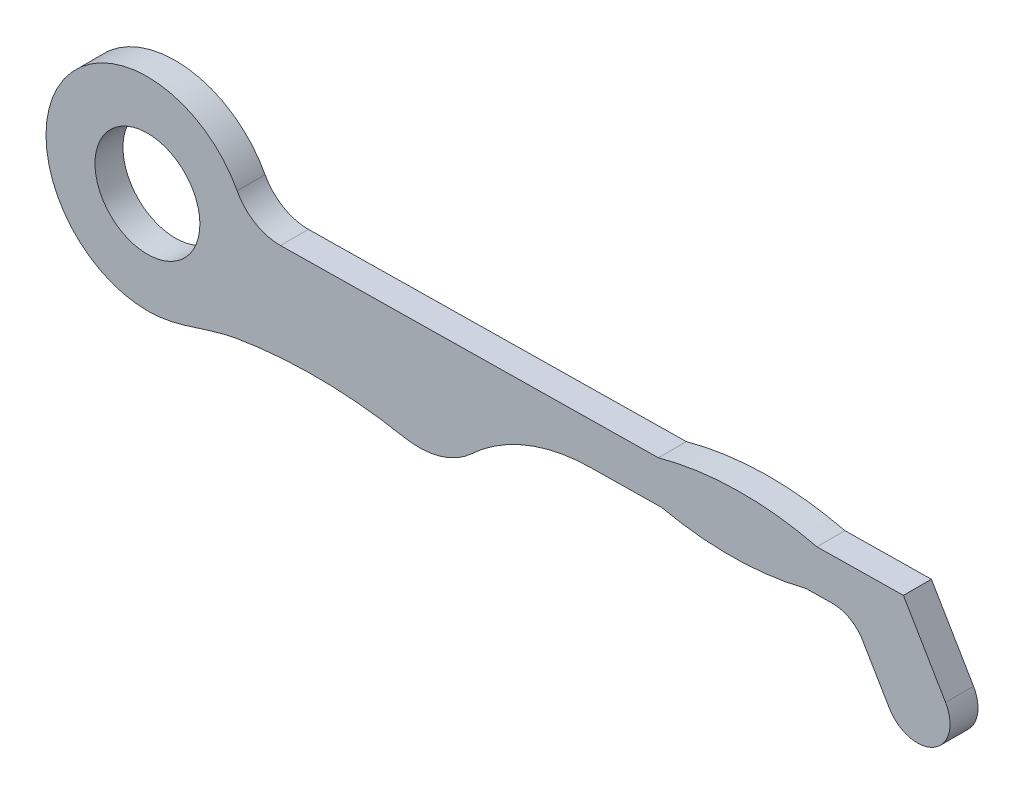
ISO-10303-21;
HEADER;
FILE_DESCRIPTION(('STEP AP214'),'2;1');
FILE_NAME('part.step','',(''),(''),'','','');
FILE_SCHEMA(('AUTOMOTIVE_DESIGN { 1 0 10303 214 1 1 1 1 }'));
ENDSEC;
DATA;
#1=APPLICATION_CONTEXT('core data for automotive mechanical design processes');
#2=APPLICATION_PROTOCOL_DEFINITION('international standard','automotive_design',2000,#1);
#3=PRODUCT_CONTEXT('',#1,'mechanical');
#4=PRODUCT('Part','Part','',(#3));
#5=PRODUCT_RELATED_PRODUCT_CATEGORY('part','',(#4));
#6=PRODUCT_DEFINITION_FORMATION('','',#4);
#7=PRODUCT_DEFINITION_CONTEXT('part definition',#1,'design');
#8=PRODUCT_DEFINITION('design','',#6,#7);
#9=PRODUCT_DEFINITION_SHAPE('','',#8);
#10=(LENGTH_UNIT() NAMED_UNIT(*) SI_UNIT(.MILLI.,.METRE.));
#11=(NAMED_UNIT(*) PLANE_ANGLE_UNIT() SI_UNIT($,.RADIAN.));
#12=(NAMED_UNIT(*) SI_UNIT($,.STERADIAN.) SOLID_ANGLE_UNIT());
#13=UNCERTAINTY_MEASURE_WITH_UNIT(LENGTH_MEASURE(1.E-05),#10,'distance_accuracy_value','');
#14=(GEOMETRIC_REPRESENTATION_CONTEXT(3) GLOBAL_UNCERTAINTY_ASSIGNED_CONTEXT((#13)) GLOBAL_UNIT_ASSIGNED_CONTEXT((#10,
#11,#12)) REPRESENTATION_CONTEXT('',''));
#15=CARTESIAN_POINT('',(0.,0.,0.));
#16=DIRECTION('',(0.,0.,1.));
#17=DIRECTION('',(1.,0.,0.));
#18=AXIS2_PLACEMENT_3D('',#15,#16,#17);
#19=CARTESIAN_POINT('',(11.0069561086532,-0.829151401691462,0.));
#20=DIRECTION('',(0.,0.,-1.));
#21=DIRECTION('',(-1.,0.,0.));
#22=AXIS2_PLACEMENT_3D('',#19,#20,#21);
#23=CYLINDRICAL_SURFACE('',#22,0.466533793959635);
#24=DIRECTION('',(0.,0.,-1.));
#25=VECTOR('',#24,1.);
#26=CARTESIAN_POINT('',(10.6048304525625,-1.06568625667051,0.4));
#27=LINE('',#26,#25);
#28=CARTESIAN_POINT('',(10.6048304525625,-1.06568625667051,0.));
#29=VERTEX_POINT('',#28);
#30=CARTESIAN_POINT('',(10.6048304525625,-1.06568625667051,0.4));
#31=VERTEX_POINT('',#30);
#32=EDGE_CURVE('E151',#29,#31,#27,.F.);
#33=ORIENTED_EDGE('',*,*,#32,.F.);
#34=CARTESIAN_POINT('',(11.0069561086532,-0.829151401691462,0.));
#35=DIRECTION('',(0.,0.,-1.));
#36=DIRECTION('',(-1.,0.,0.));
#37=AXIS2_PLACEMENT_3D('',#34,#35,#36);
#38=CIRCLE('',#37,0.466533793959635);
#39=CARTESIAN_POINT('',(11.409081764744,-0.592616546712413,0.));
#40=VERTEX_POINT('',#39);
#41=EDGE_CURVE('E24',#40,#29,#38,.T.);
#42=ORIENTED_EDGE('',*,*,#41,.F.);
#43=DIRECTION('',(0.,0.,-1.));
#44=VECTOR('',#43,1.);
#45=CARTESIAN_POINT('',(11.409081764744,-0.592616546712413,0.4));
#46=LINE('',#45,#44);
#47=CARTESIAN_POINT('',(11.409081764744,-0.592616546712413,0.4));
#48=VERTEX_POINT('',#47);
#49=EDGE_CURVE('E154',#48,#40,#46,.T.);
#50=ORIENTED_EDGE('',*,*,#49,.F.);
#51=CARTESIAN_POINT('',(11.0069561086532,-0.829151401691462,0.4));
#52=DIRECTION('',(0.,0.,-1.));
#53=DIRECTION('',(-1.,0.,0.));
#54=AXIS2_PLACEMENT_3D('',#51,#52,#53);
#55=CIRCLE('',#54,0.466533793959635);
#56=EDGE_CURVE('E11',#31,#48,#55,.F.);
#57=ORIENTED_EDGE('',*,*,#56,.F.);
#58=EDGE_LOOP('',(#33,#42,#50,#57));
#59=FACE_BOUND('',#58,.T.);
#60=ADVANCED_FACE('F17',(#59),#23,.T.);
#61=CARTESIAN_POINT('',(0.7171259454491,-1.30534728897649,0.4));
#62=DIRECTION('',(0.,0.,-1.));
#63=DIRECTION('',(-1.,0.,0.));
#64=AXIS2_PLACEMENT_3D('',#61,#62,#63);
#65=PLANE('',#64);
#66=DIRECTION('',(0.507004761587571,-0.861943253194507,0.));
#67=VECTOR('',#66,1.);
#68=CARTESIAN_POINT('',(10.8413653075415,-1.46781191276126,0.4));
#69=LINE('',#68,#67);
#70=CARTESIAN_POINT('',(10.2248321372136,-0.419662769406474,0.4));
#71=VERTEX_POINT('',#70);
#72=EDGE_CURVE('E253',#71,#31,#69,.T.);
#73=ORIENTED_EDGE('',*,*,#72,.T.);
#74=ORIENTED_EDGE('',*,*,#56,.T.);
#75=DIRECTION('',(-0.507004761587571,0.861943253194507,0.));
#76=VECTOR('',#75,1.);
#77=CARTESIAN_POINT('',(10.8068833380613,0.431162538395529,0.4));
#78=LINE('',#77,#76);
#79=CARTESIAN_POINT('',(10.8068833380613,0.431162538395529,0.4));
#80=VERTEX_POINT('',#79);
#81=EDGE_CURVE('E256',#48,#80,#78,.T.);
#82=ORIENTED_EDGE('',*,*,#81,.T.);
#83=DIRECTION('',(-0.9999073649914,-0.0136110776926834,0.));
#84=VECTOR('',#83,1.);
#85=CARTESIAN_POINT('',(9.57025830153125,0.414329179588264,0.4));
#86=LINE('',#85,#84);
#87=CARTESIAN_POINT('',(9.57025830153125,0.414329179588263,0.4));
#88=VERTEX_POINT('',#87);
#89=EDGE_CURVE('E263',#80,#88,#86,.T.);
#90=ORIENTED_EDGE('',*,*,#89,.T.);
#91=CARTESIAN_POINT('',(8.49635173682715,-3.97918408643246,0.4));
#92=DIRECTION('',(0.,0.,1.));
#93=DIRECTION('',(-1.,0.,0.));
#94=AXIS2_PLACEMENT_3D('',#91,#92,#93);
#95=CIRCLE('',#94,4.52285685473403);
#96=CARTESIAN_POINT('',(7.30325325748275,0.38346993915801,0.4));
#97=VERTEX_POINT('',#96);
#98=EDGE_CURVE('E265',#88,#97,#95,.T.);
#99=ORIENTED_EDGE('',*,*,#98,.T.);
#100=DIRECTION('',(-0.999907364991399,-0.0136110776926838,0.));
#101=VECTOR('',#100,1.);
#102=CARTESIAN_POINT('',(1.90195888158787,0.309945690847274,0.4));
#103=LINE('',#102,#101);
#104=CARTESIAN_POINT('',(1.90195888158787,0.309945690847274,0.4));
#105=VERTEX_POINT('',#104);
#106=EDGE_CURVE('E267',#97,#105,#103,.T.);
#107=ORIENTED_EDGE('',*,*,#106,.T.);
#108=CARTESIAN_POINT('',(1.89255571432794,1.00072833199703,0.4));
#109=DIRECTION('',(0.,0.,-1.));
#110=DIRECTION('',(1.,0.,0.));
#111=AXIS2_PLACEMENT_3D('',#108,#109,#110);
#112=CIRCLE('',#111,0.690846637733987);
#113=CARTESIAN_POINT('',(1.2818320272956,0.677795436543549,0.4));
#114=VERTEX_POINT('',#113);
#115=EDGE_CURVE('E269',#105,#114,#112,.T.);
#116=ORIENTED_EDGE('',*,*,#115,.T.);
#117=CARTESIAN_POINT('',(0.,0.,0.4));
#118=DIRECTION('',(0.,0.,1.));
#119=DIRECTION('',(-1.,0.,0.));
#120=AXIS2_PLACEMENT_3D('',#117,#118,#119);
#121=CIRCLE('',#120,1.45);
#122=CARTESIAN_POINT('',(0.164619343939182,-1.44062502810448,0.4));
#123=VERTEX_POINT('',#122);
#124=EDGE_CURVE('E142',#114,#123,#121,.T.);
#125=ORIENTED_EDGE('',*,*,#124,.T.);
#126=CARTESIAN_POINT('',(0.164619343939182,-1.44062502810448,0.4));
#127=CARTESIAN_POINT('',(0.54082096935865,-1.3976366976526,0.4));
#128=CARTESIAN_POINT('',(0.893291203337348,-1.21821652481014,0.4));
#129=CARTESIAN_POINT('',(1.27005170156563,-1.15459361631923,0.4));
#130=B_SPLINE_CURVE_WITH_KNOTS('',3,(#126,#127,#128,#129),.UNSPECIFIED.,.F.,.F.,(4,4),(0.,1.),.UNSPECIFIED.);
#131=CARTESIAN_POINT('',(1.27005170156563,-1.15459361631923,0.4));
#132=VERTEX_POINT('',#131);
#133=EDGE_CURVE('E136',#123,#132,#130,.T.);
#134=ORIENTED_EDGE('',*,*,#133,.T.);
#135=CARTESIAN_POINT('',(2.39897537458569,-7.83982470048959,0.4));
#136=DIRECTION('',(0.,0.,-1.));
#137=DIRECTION('',(1.,0.,0.));
#138=AXIS2_PLACEMENT_3D('',#135,#136,#137);
#139=CIRCLE('',#138,6.77988077389734);
#140=CARTESIAN_POINT('',(3.67253291127212,-1.1806329695802,0.4));
#141=VERTEX_POINT('',#140);
#142=EDGE_CURVE('E126',#132,#141,#139,.T.);
#143=ORIENTED_EDGE('',*,*,#142,.T.);
#144=CARTESIAN_POINT('',(3.87956275257858,-0.0981130460072852,0.4));
#145=DIRECTION('',(0.,0.,1.));
#146=DIRECTION('',(-1.,0.,0.));
#147=AXIS2_PLACEMENT_3D('',#144,#145,#146);
#148=CIRCLE('',#147,1.10213916549758);
#149=CARTESIAN_POINT('',(4.63202179538023,-0.903418037317869,0.4));
#150=VERTEX_POINT('',#149);
#151=EDGE_CURVE('E135',#141,#150,#148,.T.);
#152=ORIENTED_EDGE('',*,*,#151,.T.);
#153=CARTESIAN_POINT('',(6.35868867322535,-2.75135045086439,0.4));
#154=DIRECTION('',(0.,0.,-1.));
#155=DIRECTION('',(1.,0.,0.));
#156=AXIS2_PLACEMENT_3D('',#153,#154,#155);
#157=CIRCLE('',#156,2.52907744287978);
#158=CARTESIAN_POINT('',(6.3242652036595,-0.222507289095287,0.4));
#159=VERTEX_POINT('',#158);
#160=EDGE_CURVE('E229',#150,#159,#157,.T.);
#161=ORIENTED_EDGE('',*,*,#160,.T.);
#162=DIRECTION('',(0.999907364991399,0.0136110776926834,0.));
#163=VECTOR('',#162,1.);
#164=CARTESIAN_POINT('',(7.35154031889645,-0.208523672317576,0.4));
#165=LINE('',#164,#163);
#166=CARTESIAN_POINT('',(7.35154031889644,-0.208523672317575,0.4));
#167=VERTEX_POINT('',#166);
#168=EDGE_CURVE('E280',#159,#167,#165,.T.);
#169=ORIENTED_EDGE('',*,*,#168,.T.);
#170=CARTESIAN_POINT('',(8.32464084870636,4.17186383087633,0.4));
#171=DIRECTION('',(0.,0.,1.));
#172=DIRECTION('',(1.,0.,0.));
#173=AXIS2_PLACEMENT_3D('',#170,#171,#172);
#174=CIRCLE('',#173,4.48717275344439);
#175=CARTESIAN_POINT('',(9.41661336564246,-0.180413198623276,0.4));
#176=VERTEX_POINT('',#175);
#177=EDGE_CURVE('E258',#167,#176,#174,.T.);
#178=ORIENTED_EDGE('',*,*,#177,.T.);
#179=DIRECTION('',(0.9999073649914,0.0136110776926837,0.));
#180=VECTOR('',#179,1.);
#181=CARTESIAN_POINT('',(9.79079977857938,-0.175319646443995,0.4));
#182=LINE('',#181,#180);
#183=CARTESIAN_POINT('',(9.79079977857938,-0.175319646443996,0.4));
#184=VERTEX_POINT('',#183);
#185=EDGE_CURVE('E254',#176,#184,#182,.T.);
#186=ORIENTED_EDGE('',*,*,#185,.T.);
#187=CARTESIAN_POINT('',(9.79754710189913,-0.670996655548801,0.4));
#188=DIRECTION('',(0.,0.,-1.));
#189=DIRECTION('',(1.,0.,0.));
#190=AXIS2_PLACEMENT_3D('',#187,#188,#189);
#191=CIRCLE('',#190,0.495722930402726);
#192=EDGE_CURVE('E252',#184,#71,#191,.T.);
#193=ORIENTED_EDGE('',*,*,#192,.T.);
#194=EDGE_LOOP('',(#73,#74,#82,#90,#99,#107,#116,#125,#134,#143,#152,#161,#169,#178,#186,#193));
#195=FACE_BOUND('',#194,.T.);
#196=CARTESIAN_POINT('',(0.,0.,0.4));
#197=DIRECTION('',(0.,0.,1.));
#198=DIRECTION('',(1.,0.,0.));
#199=AXIS2_PLACEMENT_3D('',#196,#197,#198);
#200=CIRCLE('',#199,0.75);
#201=CARTESIAN_POINT('',(0.75,0.,0.4));
#202=VERTEX_POINT('',#201);
#203=EDGE_CURVE('E274',#202,#202,#200,.T.);
#204=ORIENTED_EDGE('',*,*,#203,.F.);
#205=EDGE_LOOP('',(#204));
#206=FACE_BOUND('',#205,.T.);
#207=ADVANCED_FACE('F139',(#195,#206),#65,.F.);
#208=CARTESIAN_POINT('',(0.7171259454491,-1.30534728897649,0.));
#209=DIRECTION('',(0.,0.,-1.));
#210=DIRECTION('',(-1.,0.,0.));
#211=AXIS2_PLACEMENT_3D('',#208,#209,#210);
#212=PLANE('',#211);
#213=DIRECTION('',(-0.507004761587571,0.861943253194507,0.));
#214=VECTOR('',#213,1.);
#215=CARTESIAN_POINT('',(10.8068833380613,0.431162538395529,0.));
#216=LINE('',#215,#214);
#217=CARTESIAN_POINT('',(10.8068833380613,0.431162538395529,0.));
#218=VERTEX_POINT('',#217);
#219=EDGE_CURVE('E169',#40,#218,#216,.T.);
#220=ORIENTED_EDGE('',*,*,#219,.F.);
#221=ORIENTED_EDGE('',*,*,#41,.T.);
#222=DIRECTION('',(0.507004761587571,-0.861943253194507,0.));
#223=VECTOR('',#222,1.);
#224=CARTESIAN_POINT('',(10.8413653075415,-1.46781191276126,0.));
#225=LINE('',#224,#223);
#226=CARTESIAN_POINT('',(10.2248321372136,-0.419662769406474,0.));
#227=VERTEX_POINT('',#226);
#228=EDGE_CURVE('E167',#227,#29,#225,.T.);
#229=ORIENTED_EDGE('',*,*,#228,.F.);
#230=CARTESIAN_POINT('',(9.79754710189913,-0.670996655548801,0.));
#231=DIRECTION('',(0.,0.,-1.));
#232=DIRECTION('',(1.,0.,0.));
#233=AXIS2_PLACEMENT_3D('',#230,#231,#232);
#234=CIRCLE('',#233,0.495722930402726);
#235=CARTESIAN_POINT('',(9.79079977857938,-0.175319646443996,0.));
#236=VERTEX_POINT('',#235);
#237=EDGE_CURVE('E176',#236,#227,#234,.T.);
#238=ORIENTED_EDGE('',*,*,#237,.F.);
#239=DIRECTION('',(0.9999073649914,0.0136110776926837,0.));
#240=VECTOR('',#239,1.);
#241=CARTESIAN_POINT('',(9.79079977857938,-0.175319646443995,0.));
#242=LINE('',#241,#240);
#243=CARTESIAN_POINT('',(9.41661336564246,-0.180413198623276,0.));
#244=VERTEX_POINT('',#243);
#245=EDGE_CURVE('E180',#244,#236,#242,.T.);
#246=ORIENTED_EDGE('',*,*,#245,.F.);
#247=CARTESIAN_POINT('',(8.32464084870636,4.17186383087633,0.));
#248=DIRECTION('',(0.,0.,1.));
#249=DIRECTION('',(1.,0.,0.));
#250=AXIS2_PLACEMENT_3D('',#247,#248,#249);
#251=CIRCLE('',#250,4.48717275344439);
#252=CARTESIAN_POINT('',(7.35154031889644,-0.208523672317575,0.));
#253=VERTEX_POINT('',#252);
#254=EDGE_CURVE('E237',#253,#244,#251,.T.);
#255=ORIENTED_EDGE('',*,*,#254,.F.);
#256=DIRECTION('',(0.999907364991399,0.0136110776926834,0.));
#257=VECTOR('',#256,1.);
#258=CARTESIAN_POINT('',(7.35154031889645,-0.208523672317576,0.));
#259=LINE('',#258,#257);
#260=CARTESIAN_POINT('',(6.3242652036595,-0.222507289095287,0.));
#261=VERTEX_POINT('',#260);
#262=EDGE_CURVE('E235',#261,#253,#259,.T.);
#263=ORIENTED_EDGE('',*,*,#262,.F.);
#264=CARTESIAN_POINT('',(6.35868867322535,-2.75135045086439,0.));
#265=DIRECTION('',(0.,0.,-1.));
#266=DIRECTION('',(1.,0.,0.));
#267=AXIS2_PLACEMENT_3D('',#264,#265,#266);
#268=CIRCLE('',#267,2.52907744287978);
#269=CARTESIAN_POINT('',(4.63202179538023,-0.903418037317869,0.));
#270=VERTEX_POINT('',#269);
#271=EDGE_CURVE('E228',#270,#261,#268,.T.);
#272=ORIENTED_EDGE('',*,*,#271,.F.);
#273=CARTESIAN_POINT('',(3.87956275257858,-0.0981130460072852,0.));
#274=DIRECTION('',(0.,0.,1.));
#275=DIRECTION('',(-1.,0.,0.));
#276=AXIS2_PLACEMENT_3D('',#273,#274,#275);
#277=CIRCLE('',#276,1.10213916549758);
#278=CARTESIAN_POINT('',(3.67253291127212,-1.1806329695802,0.));
#279=VERTEX_POINT('',#278);
#280=EDGE_CURVE('E233',#279,#270,#277,.T.);
#281=ORIENTED_EDGE('',*,*,#280,.F.);
#282=CARTESIAN_POINT('',(2.39897537458569,-7.83982470048959,0.));
#283=DIRECTION('',(0.,0.,-1.));
#284=DIRECTION('',(1.,0.,0.));
#285=AXIS2_PLACEMENT_3D('',#282,#283,#284);
#286=CIRCLE('',#285,6.77988077389734);
#287=CARTESIAN_POINT('',(1.27005170156563,-1.15459361631923,0.));
#288=VERTEX_POINT('',#287);
#289=EDGE_CURVE('E239',#288,#279,#286,.T.);
#290=ORIENTED_EDGE('',*,*,#289,.F.);
#291=CARTESIAN_POINT('',(0.164619343939182,-1.44062502810448,0.));
#292=CARTESIAN_POINT('',(0.54082096935865,-1.3976366976526,0.));
#293=CARTESIAN_POINT('',(0.893291203337348,-1.21821652481014,0.));
#294=CARTESIAN_POINT('',(1.27005170156563,-1.15459361631923,0.));
#295=B_SPLINE_CURVE_WITH_KNOTS('',3,(#291,#292,#293,#294),.UNSPECIFIED.,.F.,.F.,(4,4),(0.,1.),.UNSPECIFIED.);
#296=CARTESIAN_POINT('',(0.164619343939182,-1.44062502810448,0.));
#297=VERTEX_POINT('',#296);
#298=EDGE_CURVE('E150',#297,#288,#295,.T.);
#299=ORIENTED_EDGE('',*,*,#298,.F.);
#300=CARTESIAN_POINT('',(0.,0.,0.));
#301=DIRECTION('',(0.,0.,1.));
#302=DIRECTION('',(-1.,0.,0.));
#303=AXIS2_PLACEMENT_3D('',#300,#301,#302);
#304=CIRCLE('',#303,1.45);
#305=CARTESIAN_POINT('',(1.2818320272956,0.677795436543549,0.));
#306=VERTEX_POINT('',#305);
#307=EDGE_CURVE('E146',#306,#297,#304,.T.);
#308=ORIENTED_EDGE('',*,*,#307,.F.);
#309=CARTESIAN_POINT('',(1.89255571432794,1.00072833199703,0.));
#310=DIRECTION('',(0.,0.,-1.));
#311=DIRECTION('',(1.,0.,0.));
#312=AXIS2_PLACEMENT_3D('',#309,#310,#311);
#313=CIRCLE('',#312,0.690846637733987);
#314=CARTESIAN_POINT('',(1.90195888158787,0.309945690847274,0.));
#315=VERTEX_POINT('',#314);
#316=EDGE_CURVE('E189',#315,#306,#313,.T.);
#317=ORIENTED_EDGE('',*,*,#316,.F.);
#318=DIRECTION('',(-0.999907364991399,-0.0136110776926838,0.));
#319=VECTOR('',#318,1.);
#320=CARTESIAN_POINT('',(1.90195888158787,0.309945690847274,0.));
#321=LINE('',#320,#319);
#322=CARTESIAN_POINT('',(7.30325325748275,0.38346993915801,0.));
#323=VERTEX_POINT('',#322);
#324=EDGE_CURVE('E187',#323,#315,#321,.T.);
#325=ORIENTED_EDGE('',*,*,#324,.F.);
#326=CARTESIAN_POINT('',(8.49635173682715,-3.97918408643246,0.));
#327=DIRECTION('',(0.,0.,1.));
#328=DIRECTION('',(-1.,0.,0.));
#329=AXIS2_PLACEMENT_3D('',#326,#327,#328);
#330=CIRCLE('',#329,4.52285685473403);
#331=CARTESIAN_POINT('',(9.57025830153125,0.414329179588263,0.));
#332=VERTEX_POINT('',#331);
#333=EDGE_CURVE('E185',#332,#323,#330,.T.);
#334=ORIENTED_EDGE('',*,*,#333,.F.);
#335=DIRECTION('',(-0.9999073649914,-0.0136110776926834,0.));
#336=VECTOR('',#335,1.);
#337=CARTESIAN_POINT('',(9.57025830153125,0.414329179588264,0.));
#338=LINE('',#337,#336);
#339=EDGE_CURVE('E178',#218,#332,#338,.T.);
#340=ORIENTED_EDGE('',*,*,#339,.F.);
#341=EDGE_LOOP('',(#220,#221,#229,#238,#246,#255,#263,#272,#281,#290,#299,#308,#317,#325,#334,#340));
#342=FACE_BOUND('',#341,.T.);
#343=CARTESIAN_POINT('',(0.,0.,0.));
#344=DIRECTION('',(0.,0.,1.));
#345=DIRECTION('',(1.,0.,0.));
#346=AXIS2_PLACEMENT_3D('',#343,#344,#345);
#347=CIRCLE('',#346,0.75);
#348=CARTESIAN_POINT('',(0.75,0.,0.));
#349=VERTEX_POINT('',#348);
#350=EDGE_CURVE('E466',#349,#349,#347,.T.);
#351=ORIENTED_EDGE('',*,*,#350,.T.);
#352=EDGE_LOOP('',(#351));
#353=FACE_BOUND('',#352,.T.);
#354=ADVANCED_FACE('F163',(#342,#353),#212,.T.);
#355=DIRECTION('',(0.,0.,-1.));
#356=VECTOR('',#355,1.);
#357=SURFACE_OF_LINEAR_EXTRUSION('',#130,#356);
#358=ORIENTED_EDGE('',*,*,#298,.T.);
#359=DIRECTION('',(0.,0.,-1.));
#360=VECTOR('',#359,1.);
#361=CARTESIAN_POINT('',(1.27005170156563,-1.15459361631923,0.4));
#362=LINE('',#361,#360);
#363=EDGE_CURVE('E130',#132,#288,#362,.T.);
#364=ORIENTED_EDGE('',*,*,#363,.F.);
#365=ORIENTED_EDGE('',*,*,#133,.F.);
#366=DIRECTION('',(0.,0.,-1.));
#367=VECTOR('',#366,1.);
#368=CARTESIAN_POINT('',(0.164619343939182,-1.44062502810448,0.4));
#369=LINE('',#368,#367);
#370=EDGE_CURVE('E192',#123,#297,#369,.T.);
#371=ORIENTED_EDGE('',*,*,#370,.T.);
#372=EDGE_LOOP('',(#358,#364,#365,#371));
#373=FACE_BOUND('',#372,.T.);
#374=ADVANCED_FACE('F148',(#373),#357,.F.);
#375=CARTESIAN_POINT('',(2.39897537458569,-7.83982470048959,0.4));
#376=DIRECTION('',(0.,0.,-1.));
#377=DIRECTION('',(-1.,0.,0.));
#378=AXIS2_PLACEMENT_3D('',#375,#376,#377);
#379=CYLINDRICAL_SURFACE('',#378,6.77988077389734);
#380=ORIENTED_EDGE('',*,*,#289,.T.);
#381=DIRECTION('',(0.,0.,-1.));
#382=VECTOR('',#381,1.);
#383=CARTESIAN_POINT('',(3.67253291127212,-1.1806329695802,0.4));
#384=LINE('',#383,#382);
#385=EDGE_CURVE('E133',#141,#279,#384,.T.);
#386=ORIENTED_EDGE('',*,*,#385,.F.);
#387=ORIENTED_EDGE('',*,*,#142,.F.);
#388=ORIENTED_EDGE('',*,*,#363,.T.);
#389=EDGE_LOOP('',(#380,#386,#387,#388));
#390=FACE_BOUND('',#389,.T.);
#391=ADVANCED_FACE('F128',(#390),#379,.F.);
#392=CARTESIAN_POINT('',(3.87956275257858,-0.0981130460072852,0.4));
#393=DIRECTION('',(0.,0.,-1.));
#394=DIRECTION('',(-1.,0.,0.));
#395=AXIS2_PLACEMENT_3D('',#392,#393,#394);
#396=CYLINDRICAL_SURFACE('',#395,1.10213916549758);
#397=ORIENTED_EDGE('',*,*,#280,.T.);
#398=DIRECTION('',(0.,0.,-1.));
#399=VECTOR('',#398,1.);
#400=CARTESIAN_POINT('',(4.63202179538023,-0.903418037317869,0.4));
#401=LINE('',#400,#399);
#402=EDGE_CURVE('E156',#150,#270,#401,.T.);
#403=ORIENTED_EDGE('',*,*,#402,.F.);
#404=ORIENTED_EDGE('',*,*,#151,.F.);
#405=ORIENTED_EDGE('',*,*,#385,.T.);
#406=EDGE_LOOP('',(#397,#403,#404,#405));
#407=FACE_BOUND('',#406,.T.);
#408=ADVANCED_FACE('F278',(#407),#396,.T.);
#409=CARTESIAN_POINT('',(6.35868867322535,-2.75135045086439,0.4));
#410=DIRECTION('',(0.,0.,-1.));
#411=DIRECTION('',(-1.,0.,0.));
#412=AXIS2_PLACEMENT_3D('',#409,#410,#411);
#413=CYLINDRICAL_SURFACE('',#412,2.52907744287978);
#414=ORIENTED_EDGE('',*,*,#271,.T.);
#415=DIRECTION('',(0.,0.,-1.));
#416=VECTOR('',#415,1.);
#417=CARTESIAN_POINT('',(6.3242652036595,-0.222507289095287,0.4));
#418=LINE('',#417,#416);
#419=EDGE_CURVE('E219',#159,#261,#418,.T.);
#420=ORIENTED_EDGE('',*,*,#419,.F.);
#421=ORIENTED_EDGE('',*,*,#160,.F.);
#422=ORIENTED_EDGE('',*,*,#402,.T.);
#423=EDGE_LOOP('',(#414,#420,#421,#422));
#424=FACE_BOUND('',#423,.T.);
#425=ADVANCED_FACE('F226',(#424),#413,.F.);
#426=CARTESIAN_POINT('',(7.35154031889645,-0.208523672317576,0.4));
#427=DIRECTION('',(-0.0136110776926834,0.999907364991399,0.));
#428=DIRECTION('',(-0.999907364991399,-0.0136110776926834,0.));
#429=AXIS2_PLACEMENT_3D('',#426,#427,#428);
#430=PLANE('',#429);
#431=ORIENTED_EDGE('',*,*,#262,.T.);
#432=DIRECTION('',(0.,0.,-1.));
#433=VECTOR('',#432,1.);
#434=CARTESIAN_POINT('',(7.35154031889644,-0.208523672317575,0.4));
#435=LINE('',#434,#433);
#436=EDGE_CURVE('E216',#167,#253,#435,.T.);
#437=ORIENTED_EDGE('',*,*,#436,.F.);
#438=ORIENTED_EDGE('',*,*,#168,.F.);
#439=ORIENTED_EDGE('',*,*,#419,.T.);
#440=EDGE_LOOP('',(#431,#437,#438,#439));
#441=FACE_BOUND('',#440,.T.);
#442=ADVANCED_FACE('F289',(#441),#430,.F.);
#443=CARTESIAN_POINT('',(8.32464084870636,4.17186383087633,0.4));
#444=DIRECTION('',(0.,0.,-1.));
#445=DIRECTION('',(-1.,0.,0.));
#446=AXIS2_PLACEMENT_3D('',#443,#444,#445);
#447=CYLINDRICAL_SURFACE('',#446,4.48717275344439);
#448=ORIENTED_EDGE('',*,*,#254,.T.);
#449=DIRECTION('',(0.,0.,-1.));
#450=VECTOR('',#449,1.);
#451=CARTESIAN_POINT('',(9.41661336564246,-0.180413198623276,0.4));
#452=LINE('',#451,#450);
#453=EDGE_CURVE('E213',#176,#244,#452,.T.);
#454=ORIENTED_EDGE('',*,*,#453,.F.);
#455=ORIENTED_EDGE('',*,*,#177,.F.);
#456=ORIENTED_EDGE('',*,*,#436,.T.);
#457=EDGE_LOOP('',(#448,#454,#455,#456));
#458=FACE_BOUND('',#457,.T.);
#459=ADVANCED_FACE('F287',(#458),#447,.T.);
#460=CARTESIAN_POINT('',(9.79079977857938,-0.175319646443995,0.4));
#461=DIRECTION('',(-0.0136110776926837,0.999907364991399,0.));
#462=DIRECTION('',(-0.999907364991399,-0.0136110776926837,0.));
#463=AXIS2_PLACEMENT_3D('',#460,#461,#462);
#464=PLANE('',#463);
#465=ORIENTED_EDGE('',*,*,#245,.T.);
#466=DIRECTION('',(0.,0.,-1.));
#467=VECTOR('',#466,1.);
#468=CARTESIAN_POINT('',(9.79079977857938,-0.175319646443996,0.4));
#469=LINE('',#468,#467);
#470=EDGE_CURVE('E210',#184,#236,#469,.T.);
#471=ORIENTED_EDGE('',*,*,#470,.F.);
#472=ORIENTED_EDGE('',*,*,#185,.F.);
#473=ORIENTED_EDGE('',*,*,#453,.T.);
#474=EDGE_LOOP('',(#465,#471,#472,#473));
#475=FACE_BOUND('',#474,.T.);
#476=ADVANCED_FACE('F246',(#475),#464,.F.);
#477=CARTESIAN_POINT('',(9.79754710189913,-0.670996655548801,0.4));
#478=DIRECTION('',(0.,0.,-1.));
#479=DIRECTION('',(-1.,0.,0.));
#480=AXIS2_PLACEMENT_3D('',#477,#478,#479);
#481=CYLINDRICAL_SURFACE('',#480,0.495722930402726);
#482=ORIENTED_EDGE('',*,*,#237,.T.);
#483=DIRECTION('',(0.,0.,-1.));
#484=VECTOR('',#483,1.);
#485=CARTESIAN_POINT('',(10.2248321372136,-0.419662769406474,0.4));
#486=LINE('',#485,#484);
#487=EDGE_CURVE('E175',#71,#227,#486,.T.);
#488=ORIENTED_EDGE('',*,*,#487,.F.);
#489=ORIENTED_EDGE('',*,*,#192,.F.);
#490=ORIENTED_EDGE('',*,*,#470,.T.);
#491=EDGE_LOOP('',(#482,#488,#489,#490));
#492=FACE_BOUND('',#491,.T.);
#493=ADVANCED_FACE('F251',(#492),#481,.F.);
#494=CARTESIAN_POINT('',(10.8413653075415,-1.46781191276126,0.4));
#495=DIRECTION('',(0.861943253194507,0.507004761587571,0.));
#496=DIRECTION('',(-0.507004761587571,0.861943253194508,0.));
#497=AXIS2_PLACEMENT_3D('',#494,#495,#496);
#498=PLANE('',#497);
#499=ORIENTED_EDGE('',*,*,#228,.T.);
#500=ORIENTED_EDGE('',*,*,#32,.T.);
#501=ORIENTED_EDGE('',*,*,#72,.F.);
#502=ORIENTED_EDGE('',*,*,#487,.T.);
#503=EDGE_LOOP('',(#499,#500,#501,#502));
#504=FACE_BOUND('',#503,.T.);
#505=ADVANCED_FACE('F173',(#504),#498,.F.);
#506=CARTESIAN_POINT('',(10.8068833380613,0.431162538395529,0.4));
#507=DIRECTION('',(-0.861943253194507,-0.507004761587571,0.));
#508=DIRECTION('',(0.507004761587571,-0.861943253194507,0.));
#509=AXIS2_PLACEMENT_3D('',#506,#507,#508);
#510=PLANE('',#509);
#511=ORIENTED_EDGE('',*,*,#81,.F.);
#512=ORIENTED_EDGE('',*,*,#49,.T.);
#513=ORIENTED_EDGE('',*,*,#219,.T.);
#514=DIRECTION('',(0.,0.,-1.));
#515=VECTOR('',#514,1.);
#516=CARTESIAN_POINT('',(10.8068833380613,0.431162538395529,0.4));
#517=LINE('',#516,#515);
#518=EDGE_CURVE('E206',#80,#218,#517,.T.);
#519=ORIENTED_EDGE('',*,*,#518,.F.);
#520=EDGE_LOOP('',(#511,#512,#513,#519));
#521=FACE_BOUND('',#520,.T.);
#522=ADVANCED_FACE('F333',(#521),#510,.F.);
#523=CARTESIAN_POINT('',(9.57025830153125,0.414329179588264,0.4));
#524=DIRECTION('',(0.0136110776926834,-0.999907364991399,0.));
#525=DIRECTION('',(0.999907364991399,0.0136110776926834,0.));
#526=AXIS2_PLACEMENT_3D('',#523,#524,#525);
#527=PLANE('',#526);
#528=ORIENTED_EDGE('',*,*,#339,.T.);
#529=DIRECTION('',(0.,0.,-1.));
#530=VECTOR('',#529,1.);
#531=CARTESIAN_POINT('',(9.57025830153125,0.414329179588263,0.4));
#532=LINE('',#531,#530);
#533=EDGE_CURVE('E203',#88,#332,#532,.T.);
#534=ORIENTED_EDGE('',*,*,#533,.F.);
#535=ORIENTED_EDGE('',*,*,#89,.F.);
#536=ORIENTED_EDGE('',*,*,#518,.T.);
#537=EDGE_LOOP('',(#528,#534,#535,#536));
#538=FACE_BOUND('',#537,.T.);
#539=ADVANCED_FACE('F329',(#538),#527,.F.);
#540=CARTESIAN_POINT('',(8.49635173682715,-3.97918408643246,0.4));
#541=DIRECTION('',(0.,0.,-1.));
#542=DIRECTION('',(-1.,0.,0.));
#543=AXIS2_PLACEMENT_3D('',#540,#541,#542);
#544=CYLINDRICAL_SURFACE('',#543,4.52285685473403);
#545=ORIENTED_EDGE('',*,*,#333,.T.);
#546=DIRECTION('',(0.,0.,-1.));
#547=VECTOR('',#546,1.);
#548=CARTESIAN_POINT('',(7.30325325748275,0.38346993915801,0.4));
#549=LINE('',#548,#547);
#550=EDGE_CURVE('E200',#97,#323,#549,.T.);
#551=ORIENTED_EDGE('',*,*,#550,.F.);
#552=ORIENTED_EDGE('',*,*,#98,.F.);
#553=ORIENTED_EDGE('',*,*,#533,.T.);
#554=EDGE_LOOP('',(#545,#551,#552,#553));
#555=FACE_BOUND('',#554,.T.);
#556=ADVANCED_FACE('F325',(#555),#544,.T.);
#557=CARTESIAN_POINT('',(1.90195888158787,0.309945690847274,0.4));
#558=DIRECTION('',(0.0136110776926838,-0.9999073649914,0.));
#559=DIRECTION('',(0.9999073649914,0.0136110776926838,0.));
#560=AXIS2_PLACEMENT_3D('',#557,#558,#559);
#561=PLANE('',#560);
#562=ORIENTED_EDGE('',*,*,#324,.T.);
#563=DIRECTION('',(0.,0.,-1.));
#564=VECTOR('',#563,1.);
#565=CARTESIAN_POINT('',(1.90195888158787,0.309945690847274,0.4));
#566=LINE('',#565,#564);
#567=EDGE_CURVE('E197',#105,#315,#566,.T.);
#568=ORIENTED_EDGE('',*,*,#567,.F.);
#569=ORIENTED_EDGE('',*,*,#106,.F.);
#570=ORIENTED_EDGE('',*,*,#550,.T.);
#571=EDGE_LOOP('',(#562,#568,#569,#570));
#572=FACE_BOUND('',#571,.T.);
#573=ADVANCED_FACE('F321',(#572),#561,.F.);
#574=CARTESIAN_POINT('',(1.89255571432794,1.00072833199703,0.4));
#575=DIRECTION('',(0.,0.,-1.));
#576=DIRECTION('',(-1.,0.,0.));
#577=AXIS2_PLACEMENT_3D('',#574,#575,#576);
#578=CYLINDRICAL_SURFACE('',#577,0.690846637733987);
#579=ORIENTED_EDGE('',*,*,#316,.T.);
#580=DIRECTION('',(0.,0.,-1.));
#581=VECTOR('',#580,1.);
#582=CARTESIAN_POINT('',(1.2818320272956,0.677795436543549,0.4));
#583=LINE('',#582,#581);
#584=EDGE_CURVE('E194',#114,#306,#583,.T.);
#585=ORIENTED_EDGE('',*,*,#584,.F.);
#586=ORIENTED_EDGE('',*,*,#115,.F.);
#587=ORIENTED_EDGE('',*,*,#567,.T.);
#588=EDGE_LOOP('',(#579,#585,#586,#587));
#589=FACE_BOUND('',#588,.T.);
#590=ADVANCED_FACE('F317',(#589),#578,.F.);
#591=CARTESIAN_POINT('',(0.,0.,0.4));
#592=DIRECTION('',(0.,0.,-1.));
#593=DIRECTION('',(-1.,0.,0.));
#594=AXIS2_PLACEMENT_3D('',#591,#592,#593);
#595=CYLINDRICAL_SURFACE('',#594,1.45);
#596=ORIENTED_EDGE('',*,*,#307,.T.);
#597=ORIENTED_EDGE('',*,*,#370,.F.);
#598=ORIENTED_EDGE('',*,*,#124,.F.);
#599=ORIENTED_EDGE('',*,*,#584,.T.);
#600=EDGE_LOOP('',(#596,#597,#598,#599));
#601=FACE_BOUND('',#600,.T.);
#602=ADVANCED_FACE('F314',(#601),#595,.T.);
#603=CARTESIAN_POINT('',(0.,0.,0.4));
#604=DIRECTION('',(0.,0.,-1.));
#605=DIRECTION('',(-1.,0.,0.));
#606=AXIS2_PLACEMENT_3D('',#603,#604,#605);
#607=CYLINDRICAL_SURFACE('',#606,0.75);
#608=ORIENTED_EDGE('',*,*,#203,.T.);
#609=EDGE_LOOP('',(#608));
#610=FACE_BOUND('',#609,.T.);
#611=ORIENTED_EDGE('',*,*,#350,.F.);
#612=EDGE_LOOP('',(#611));
#613=FACE_BOUND('',#612,.T.);
#614=ADVANCED_FACE('F312',(#610,#613),#607,.F.);
#615=CLOSED_SHELL('',(#60,#207,#354,#374,#391,#408,#425,#442,#459,#476,#493,#505,#522,#539,#556,
#573,#590,#602,#614));
#616=MANIFOLD_SOLID_BREP('B1',#615);
#617=ADVANCED_BREP_SHAPE_REPRESENTATION('',(#18,#616),#14);
#618=SHAPE_DEFINITION_REPRESENTATION(#9,#617);
ENDSEC;
END-ISO-10303-21;
